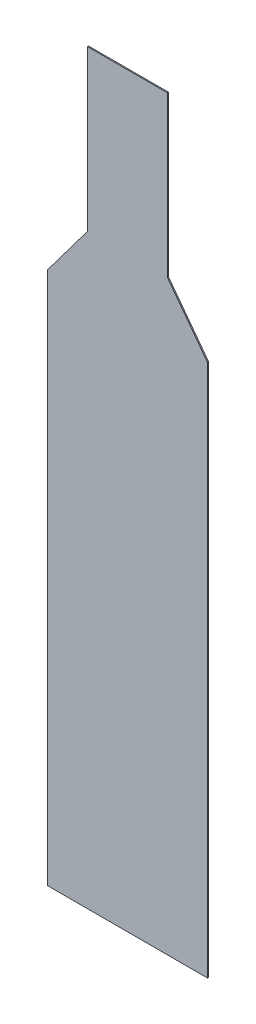
ISO-10303-21;
HEADER;
FILE_DESCRIPTION(('STEP AP214'),'2;1');
FILE_NAME('part.step','',(''),(''),'','','');
FILE_SCHEMA(('AUTOMOTIVE_DESIGN { 1 0 10303 214 1 1 1 1 }'));
ENDSEC;
DATA;
#1=APPLICATION_CONTEXT('core data for automotive mechanical design processes');
#2=APPLICATION_PROTOCOL_DEFINITION('international standard','automotive_design',2000,#1);
#3=PRODUCT_CONTEXT('',#1,'mechanical');
#4=PRODUCT('Part','Part','',(#3));
#5=PRODUCT_RELATED_PRODUCT_CATEGORY('part','',(#4));
#6=PRODUCT_DEFINITION_FORMATION('','',#4);
#7=PRODUCT_DEFINITION_CONTEXT('part definition',#1,'design');
#8=PRODUCT_DEFINITION('design','',#6,#7);
#9=PRODUCT_DEFINITION_SHAPE('','',#8);
#10=(LENGTH_UNIT() NAMED_UNIT(*) SI_UNIT(.MILLI.,.METRE.));
#11=(NAMED_UNIT(*) PLANE_ANGLE_UNIT() SI_UNIT($,.RADIAN.));
#12=(NAMED_UNIT(*) SI_UNIT($,.STERADIAN.) SOLID_ANGLE_UNIT());
#13=UNCERTAINTY_MEASURE_WITH_UNIT(LENGTH_MEASURE(1.E-05),#10,'distance_accuracy_value','');
#14=(GEOMETRIC_REPRESENTATION_CONTEXT(3) GLOBAL_UNCERTAINTY_ASSIGNED_CONTEXT((#13)) GLOBAL_UNIT_ASSIGNED_CONTEXT((#10,
#11,#12)) REPRESENTATION_CONTEXT('',''));
#15=CARTESIAN_POINT('',(0.,0.,0.));
#16=DIRECTION('',(0.,0.,1.));
#17=DIRECTION('',(1.,0.,0.));
#18=AXIS2_PLACEMENT_3D('',#15,#16,#17);
#19=CARTESIAN_POINT('',(3.74999999999994,55.,0.1));
#20=DIRECTION('',(0.8,0.6,0.));
#21=DIRECTION('',(-0.6,0.8,0.));
#22=AXIS2_PLACEMENT_3D('',#19,#20,#21);
#23=PLANE('',#22);
#24=DIRECTION('',(0.6,-0.8,0.));
#25=VECTOR('',#24,1.);
#26=CARTESIAN_POINT('',(3.74999999999994,55.,0.));
#27=LINE('',#26,#25);
#28=CARTESIAN_POINT('',(3.74999999999994,55.,0.));
#29=VERTEX_POINT('',#28);
#30=CARTESIAN_POINT('',(7.49999999999994,50.,0.));
#31=VERTEX_POINT('',#30);
#32=EDGE_CURVE('E152',#29,#31,#27,.T.);
#33=ORIENTED_EDGE('',*,*,#32,.F.);
#34=DIRECTION('',(0.,0.,-1.));
#35=VECTOR('',#34,1.);
#36=CARTESIAN_POINT('',(3.74999999999994,55.,0.1));
#37=LINE('',#36,#35);
#38=CARTESIAN_POINT('',(3.74999999999994,55.,0.1));
#39=VERTEX_POINT('',#38);
#40=EDGE_CURVE('E11',#39,#29,#37,.T.);
#41=ORIENTED_EDGE('',*,*,#40,.F.);
#42=DIRECTION('',(0.6,-0.8,0.));
#43=VECTOR('',#42,1.);
#44=CARTESIAN_POINT('',(3.74999999999994,55.,0.1));
#45=LINE('',#44,#43);
#46=CARTESIAN_POINT('',(7.49999999999994,50.,0.1));
#47=VERTEX_POINT('',#46);
#48=EDGE_CURVE('E180',#39,#47,#45,.T.);
#49=ORIENTED_EDGE('',*,*,#48,.T.);
#50=DIRECTION('',(0.,0.,-1.));
#51=VECTOR('',#50,1.);
#52=CARTESIAN_POINT('',(7.49999999999994,50.,0.1));
#53=LINE('',#52,#51);
#54=EDGE_CURVE('E52',#47,#31,#53,.T.);
#55=ORIENTED_EDGE('',*,*,#54,.T.);
#56=EDGE_LOOP('',(#33,#41,#49,#55));
#57=FACE_BOUND('',#56,.T.);
#58=ADVANCED_FACE('F49',(#57),#23,.T.);
#59=CARTESIAN_POINT('',(3.74999999999994,70.,0.1));
#60=DIRECTION('',(1.,0.,0.));
#61=DIRECTION('',(0.,0.,-1.));
#62=AXIS2_PLACEMENT_3D('',#59,#60,#61);
#63=PLANE('',#62);
#64=DIRECTION('',(0.,-1.,0.));
#65=VECTOR('',#64,1.);
#66=CARTESIAN_POINT('',(3.74999999999994,70.,0.));
#67=LINE('',#66,#65);
#68=CARTESIAN_POINT('',(3.74999999999994,70.,0.));
#69=VERTEX_POINT('',#68);
#70=EDGE_CURVE('E177',#69,#29,#67,.T.);
#71=ORIENTED_EDGE('',*,*,#70,.F.);
#72=DIRECTION('',(0.,0.,-1.));
#73=VECTOR('',#72,1.);
#74=CARTESIAN_POINT('',(3.74999999999994,70.,0.1));
#75=LINE('',#74,#73);
#76=CARTESIAN_POINT('',(3.74999999999994,70.,0.1));
#77=VERTEX_POINT('',#76);
#78=EDGE_CURVE('E59',#77,#69,#75,.T.);
#79=ORIENTED_EDGE('',*,*,#78,.F.);
#80=DIRECTION('',(0.,-1.,0.));
#81=VECTOR('',#80,1.);
#82=CARTESIAN_POINT('',(3.74999999999994,70.,0.1));
#83=LINE('',#82,#81);
#84=EDGE_CURVE('E138',#77,#39,#83,.T.);
#85=ORIENTED_EDGE('',*,*,#84,.T.);
#86=ORIENTED_EDGE('',*,*,#40,.T.);
#87=EDGE_LOOP('',(#71,#79,#85,#86));
#88=FACE_BOUND('',#87,.T.);
#89=ADVANCED_FACE('F198',(#88),#63,.T.);
#90=CARTESIAN_POINT('',(-3.75000000000006,70.,0.1));
#91=DIRECTION('',(0.,1.,0.));
#92=DIRECTION('',(0.,0.,1.));
#93=AXIS2_PLACEMENT_3D('',#90,#91,#92);
#94=PLANE('',#93);
#95=DIRECTION('',(1.,0.,0.));
#96=VECTOR('',#95,1.);
#97=CARTESIAN_POINT('',(-3.75000000000006,70.,0.));
#98=LINE('',#97,#96);
#99=CARTESIAN_POINT('',(-3.75000000000006,70.,0.));
#100=VERTEX_POINT('',#99);
#101=EDGE_CURVE('E124',#100,#69,#98,.T.);
#102=ORIENTED_EDGE('',*,*,#101,.F.);
#103=DIRECTION('',(0.,0.,-1.));
#104=VECTOR('',#103,1.);
#105=CARTESIAN_POINT('',(-3.75000000000006,70.,0.1));
#106=LINE('',#105,#104);
#107=CARTESIAN_POINT('',(-3.75000000000006,70.,0.1));
#108=VERTEX_POINT('',#107);
#109=EDGE_CURVE('E119',#108,#100,#106,.T.);
#110=ORIENTED_EDGE('',*,*,#109,.F.);
#111=DIRECTION('',(1.,0.,0.));
#112=VECTOR('',#111,1.);
#113=CARTESIAN_POINT('',(-3.75000000000006,70.,0.1));
#114=LINE('',#113,#112);
#115=EDGE_CURVE('E122',#108,#77,#114,.T.);
#116=ORIENTED_EDGE('',*,*,#115,.T.);
#117=ORIENTED_EDGE('',*,*,#78,.T.);
#118=EDGE_LOOP('',(#102,#110,#116,#117));
#119=FACE_BOUND('',#118,.T.);
#120=ADVANCED_FACE('F121',(#119),#94,.T.);
#121=CARTESIAN_POINT('',(-3.75000000000006,55.,0.1));
#122=DIRECTION('',(-1.,0.,0.));
#123=DIRECTION('',(0.,0.,1.));
#124=AXIS2_PLACEMENT_3D('',#121,#122,#123);
#125=PLANE('',#124);
#126=DIRECTION('',(0.,1.,0.));
#127=VECTOR('',#126,1.);
#128=CARTESIAN_POINT('',(-3.75000000000006,55.,0.));
#129=LINE('',#128,#127);
#130=CARTESIAN_POINT('',(-3.75000000000006,55.,0.));
#131=VERTEX_POINT('',#130);
#132=EDGE_CURVE('E172',#131,#100,#129,.T.);
#133=ORIENTED_EDGE('',*,*,#132,.F.);
#134=DIRECTION('',(0.,0.,-1.));
#135=VECTOR('',#134,1.);
#136=CARTESIAN_POINT('',(-3.75000000000006,55.,0.1));
#137=LINE('',#136,#135);
#138=CARTESIAN_POINT('',(-3.75000000000006,55.,0.1));
#139=VERTEX_POINT('',#138);
#140=EDGE_CURVE('E130',#139,#131,#137,.T.);
#141=ORIENTED_EDGE('',*,*,#140,.F.);
#142=DIRECTION('',(0.,1.,0.));
#143=VECTOR('',#142,1.);
#144=CARTESIAN_POINT('',(-3.75000000000006,55.,0.1));
#145=LINE('',#144,#143);
#146=EDGE_CURVE('E136',#139,#108,#145,.T.);
#147=ORIENTED_EDGE('',*,*,#146,.T.);
#148=ORIENTED_EDGE('',*,*,#109,.T.);
#149=EDGE_LOOP('',(#133,#141,#147,#148));
#150=FACE_BOUND('',#149,.T.);
#151=ADVANCED_FACE('F141',(#150),#125,.T.);
#152=CARTESIAN_POINT('',(-7.5,50.,0.1));
#153=DIRECTION('',(-0.800000000000005,0.599999999999993,0.));
#154=DIRECTION('',(-0.599999999999993,-0.800000000000005,0.));
#155=AXIS2_PLACEMENT_3D('',#152,#153,#154);
#156=PLANE('',#155);
#157=DIRECTION('',(0.599999999999993,0.800000000000005,0.));
#158=VECTOR('',#157,1.);
#159=CARTESIAN_POINT('',(-7.5,50.,0.));
#160=LINE('',#159,#158);
#161=CARTESIAN_POINT('',(-7.5,50.,0.));
#162=VERTEX_POINT('',#161);
#163=EDGE_CURVE('E168',#162,#131,#160,.T.);
#164=ORIENTED_EDGE('',*,*,#163,.F.);
#165=DIRECTION('',(0.,0.,-1.));
#166=VECTOR('',#165,1.);
#167=CARTESIAN_POINT('',(-7.5,50.,0.1));
#168=LINE('',#167,#166);
#169=CARTESIAN_POINT('',(-7.5,50.,0.1));
#170=VERTEX_POINT('',#169);
#171=EDGE_CURVE('E186',#170,#162,#168,.T.);
#172=ORIENTED_EDGE('',*,*,#171,.F.);
#173=DIRECTION('',(0.599999999999993,0.800000000000005,0.));
#174=VECTOR('',#173,1.);
#175=CARTESIAN_POINT('',(-7.5,50.,0.1));
#176=LINE('',#175,#174);
#177=EDGE_CURVE('E143',#170,#139,#176,.T.);
#178=ORIENTED_EDGE('',*,*,#177,.T.);
#179=ORIENTED_EDGE('',*,*,#140,.T.);
#180=EDGE_LOOP('',(#164,#172,#178,#179));
#181=FACE_BOUND('',#180,.T.);
#182=ADVANCED_FACE('F211',(#181),#156,.T.);
#183=CARTESIAN_POINT('',(-7.5,0.,0.1));
#184=DIRECTION('',(-1.,0.,0.));
#185=DIRECTION('',(0.,-1.,0.));
#186=AXIS2_PLACEMENT_3D('',#183,#184,#185);
#187=PLANE('',#186);
#188=DIRECTION('',(0.,1.,0.));
#189=VECTOR('',#188,1.);
#190=CARTESIAN_POINT('',(-7.5,0.,0.));
#191=LINE('',#190,#189);
#192=CARTESIAN_POINT('',(-7.5,0.,0.));
#193=VERTEX_POINT('',#192);
#194=EDGE_CURVE('E164',#193,#162,#191,.T.);
#195=ORIENTED_EDGE('',*,*,#194,.F.);
#196=DIRECTION('',(0.,0.,-1.));
#197=VECTOR('',#196,1.);
#198=CARTESIAN_POINT('',(-7.5,0.,0.1));
#199=LINE('',#198,#197);
#200=CARTESIAN_POINT('',(-7.5,0.,0.1));
#201=VERTEX_POINT('',#200);
#202=EDGE_CURVE('E189',#201,#193,#199,.T.);
#203=ORIENTED_EDGE('',*,*,#202,.F.);
#204=DIRECTION('',(0.,1.,0.));
#205=VECTOR('',#204,1.);
#206=CARTESIAN_POINT('',(-7.5,0.,0.1));
#207=LINE('',#206,#205);
#208=EDGE_CURVE('E146',#201,#170,#207,.T.);
#209=ORIENTED_EDGE('',*,*,#208,.T.);
#210=ORIENTED_EDGE('',*,*,#171,.T.);
#211=EDGE_LOOP('',(#195,#203,#209,#210));
#212=FACE_BOUND('',#211,.T.);
#213=ADVANCED_FACE('F214',(#212),#187,.T.);
#214=CARTESIAN_POINT('',(7.5,0.,0.1));
#215=DIRECTION('',(0.,-1.,0.));
#216=DIRECTION('',(1.,0.,0.));
#217=AXIS2_PLACEMENT_3D('',#214,#215,#216);
#218=PLANE('',#217);
#219=DIRECTION('',(-1.,0.,0.));
#220=VECTOR('',#219,1.);
#221=CARTESIAN_POINT('',(7.5,0.,0.));
#222=LINE('',#221,#220);
#223=CARTESIAN_POINT('',(7.5,0.,0.));
#224=VERTEX_POINT('',#223);
#225=EDGE_CURVE('E160',#224,#193,#222,.T.);
#226=ORIENTED_EDGE('',*,*,#225,.F.);
#227=DIRECTION('',(0.,0.,-1.));
#228=VECTOR('',#227,1.);
#229=CARTESIAN_POINT('',(7.5,0.,0.1));
#230=LINE('',#229,#228);
#231=CARTESIAN_POINT('',(7.5,0.,0.1));
#232=VERTEX_POINT('',#231);
#233=EDGE_CURVE('E191',#232,#224,#230,.T.);
#234=ORIENTED_EDGE('',*,*,#233,.F.);
#235=DIRECTION('',(-1.,0.,0.));
#236=VECTOR('',#235,1.);
#237=CARTESIAN_POINT('',(7.5,0.,0.1));
#238=LINE('',#237,#236);
#239=EDGE_CURVE('E329',#232,#201,#238,.T.);
#240=ORIENTED_EDGE('',*,*,#239,.T.);
#241=ORIENTED_EDGE('',*,*,#202,.T.);
#242=EDGE_LOOP('',(#226,#234,#240,#241));
#243=FACE_BOUND('',#242,.T.);
#244=ADVANCED_FACE('F218',(#243),#218,.T.);
#245=CARTESIAN_POINT('',(7.49999999999994,50.,0.1));
#246=DIRECTION('',(1.,0.,0.));
#247=DIRECTION('',(0.,1.,0.));
#248=AXIS2_PLACEMENT_3D('',#245,#246,#247);
#249=PLANE('',#248);
#250=DIRECTION('',(0.,-1.,0.));
#251=VECTOR('',#250,1.);
#252=CARTESIAN_POINT('',(7.49999999999994,50.,0.));
#253=LINE('',#252,#251);
#254=EDGE_CURVE('E156',#31,#224,#253,.T.);
#255=ORIENTED_EDGE('',*,*,#254,.F.);
#256=ORIENTED_EDGE('',*,*,#54,.F.);
#257=DIRECTION('',(0.,-1.,0.));
#258=VECTOR('',#257,1.);
#259=CARTESIAN_POINT('',(7.49999999999994,50.,0.1));
#260=LINE('',#259,#258);
#261=EDGE_CURVE('E332',#47,#232,#260,.T.);
#262=ORIENTED_EDGE('',*,*,#261,.T.);
#263=ORIENTED_EDGE('',*,*,#233,.T.);
#264=EDGE_LOOP('',(#255,#256,#262,#263));
#265=FACE_BOUND('',#264,.T.);
#266=ADVANCED_FACE('F195',(#265),#249,.T.);
#267=CARTESIAN_POINT('',(0.,0.,0.1));
#268=DIRECTION('',(0.,0.,1.));
#269=DIRECTION('',(1.,0.,0.));
#270=AXIS2_PLACEMENT_3D('',#267,#268,#269);
#271=PLANE('',#270);
#272=ORIENTED_EDGE('',*,*,#48,.F.);
#273=ORIENTED_EDGE('',*,*,#84,.F.);
#274=ORIENTED_EDGE('',*,*,#115,.F.);
#275=ORIENTED_EDGE('',*,*,#146,.F.);
#276=ORIENTED_EDGE('',*,*,#177,.F.);
#277=ORIENTED_EDGE('',*,*,#208,.F.);
#278=ORIENTED_EDGE('',*,*,#239,.F.);
#279=ORIENTED_EDGE('',*,*,#261,.F.);
#280=EDGE_LOOP('',(#272,#273,#274,#275,#276,#277,#278,#279));
#281=FACE_BOUND('',#280,.T.);
#282=ADVANCED_FACE('F134',(#281),#271,.T.);
#283=CARTESIAN_POINT('',(0.,0.,0.));
#284=DIRECTION('',(0.,0.,1.));
#285=DIRECTION('',(1.,0.,0.));
#286=AXIS2_PLACEMENT_3D('',#283,#284,#285);
#287=PLANE('',#286);
#288=ORIENTED_EDGE('',*,*,#32,.T.);
#289=ORIENTED_EDGE('',*,*,#254,.T.);
#290=ORIENTED_EDGE('',*,*,#225,.T.);
#291=ORIENTED_EDGE('',*,*,#194,.T.);
#292=ORIENTED_EDGE('',*,*,#163,.T.);
#293=ORIENTED_EDGE('',*,*,#132,.T.);
#294=ORIENTED_EDGE('',*,*,#101,.T.);
#295=ORIENTED_EDGE('',*,*,#70,.T.);
#296=EDGE_LOOP('',(#288,#289,#290,#291,#292,#293,#294,#295));
#297=FACE_BOUND('',#296,.T.);
#298=ADVANCED_FACE('F197',(#297),#287,.F.);
#299=CLOSED_SHELL('',(#58,#89,#120,#151,#182,#213,#244,#266,#282,#298));
#300=MANIFOLD_SOLID_BREP('B2',#299);
#301=ADVANCED_BREP_SHAPE_REPRESENTATION('',(#18,#300),#14);
#302=SHAPE_DEFINITION_REPRESENTATION(#9,#301);
ENDSEC;
END-ISO-10303-21;
